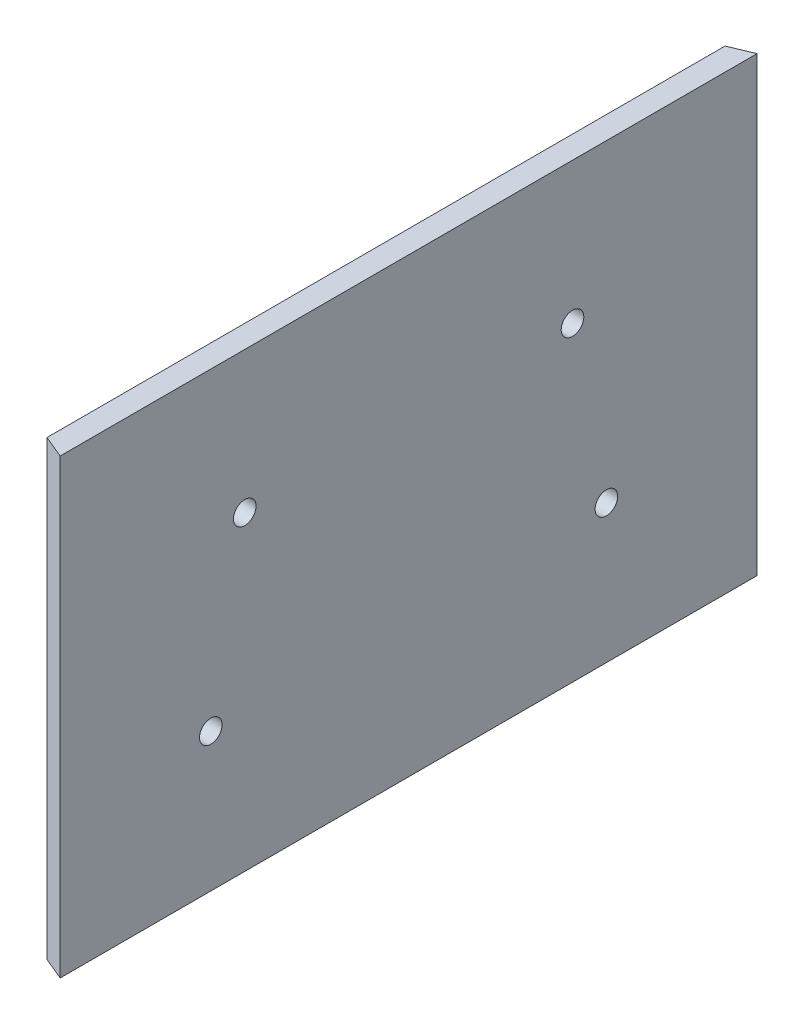
ISO-10303-21;
HEADER;
FILE_DESCRIPTION(('STEP AP214'),'2;1');
FILE_NAME('part.step','',(''),(''),'','','');
FILE_SCHEMA(('AUTOMOTIVE_DESIGN { 1 0 10303 214 1 1 1 1 }'));
ENDSEC;
DATA;
#1=APPLICATION_CONTEXT('core data for automotive mechanical design processes');
#2=APPLICATION_PROTOCOL_DEFINITION('international standard','automotive_design',2000,#1);
#3=PRODUCT_CONTEXT('',#1,'mechanical');
#4=PRODUCT('Part','Part','',(#3));
#5=PRODUCT_RELATED_PRODUCT_CATEGORY('part','',(#4));
#6=PRODUCT_DEFINITION_FORMATION('','',#4);
#7=PRODUCT_DEFINITION_CONTEXT('part definition',#1,'design');
#8=PRODUCT_DEFINITION('design','',#6,#7);
#9=PRODUCT_DEFINITION_SHAPE('','',#8);
#10=(LENGTH_UNIT() NAMED_UNIT(*) SI_UNIT(.MILLI.,.METRE.));
#11=(NAMED_UNIT(*) PLANE_ANGLE_UNIT() SI_UNIT($,.RADIAN.));
#12=(NAMED_UNIT(*) SI_UNIT($,.STERADIAN.) SOLID_ANGLE_UNIT());
#13=UNCERTAINTY_MEASURE_WITH_UNIT(LENGTH_MEASURE(1.E-05),#10,'distance_accuracy_value','');
#14=(GEOMETRIC_REPRESENTATION_CONTEXT(3) GLOBAL_UNCERTAINTY_ASSIGNED_CONTEXT((#13)) GLOBAL_UNIT_ASSIGNED_CONTEXT((#10,
#11,#12)) REPRESENTATION_CONTEXT('',''));
#15=CARTESIAN_POINT('',(0.,0.,0.));
#16=DIRECTION('',(0.,0.,1.));
#17=DIRECTION('',(1.,0.,0.));
#18=AXIS2_PLACEMENT_3D('',#15,#16,#17);
#19=CARTESIAN_POINT('',(0.,50.,-120.));
#20=DIRECTION('',(1.,0.,0.));
#21=DIRECTION('',(0.,0.,-1.));
#22=AXIS2_PLACEMENT_3D('',#19,#20,#21);
#23=PLANE('',#22);
#24=CARTESIAN_POINT('',(0.,25.,-31.));
#25=DIRECTION('',(-1.,0.,0.));
#26=DIRECTION('',(0.,1.,0.));
#27=AXIS2_PLACEMENT_3D('',#24,#25,#26);
#28=CIRCLE('',#27,2.00000000000003);
#29=CARTESIAN_POINT('',(0.,27.,-31.));
#30=VERTEX_POINT('',#29);
#31=EDGE_CURVE('E103',#30,#30,#28,.T.);
#32=ORIENTED_EDGE('',*,*,#31,.T.);
#33=EDGE_LOOP('',(#32));
#34=FACE_BOUND('',#33,.T.);
#35=CARTESIAN_POINT('',(0.,-5.49999999999999,-25.));
#36=DIRECTION('',(-1.,0.,0.));
#37=DIRECTION('',(0.,1.,0.));
#38=AXIS2_PLACEMENT_3D('',#35,#36,#37);
#39=CIRCLE('',#38,2.00000000000003);
#40=CARTESIAN_POINT('',(0.,-3.49999999999996,-25.));
#41=VERTEX_POINT('',#40);
#42=EDGE_CURVE('E109',#41,#41,#39,.T.);
#43=ORIENTED_EDGE('',*,*,#42,.T.);
#44=EDGE_LOOP('',(#43));
#45=FACE_BOUND('',#44,.T.);
#46=CARTESIAN_POINT('',(0.,-5.5,-95.));
#47=DIRECTION('',(-1.,0.,0.));
#48=DIRECTION('',(0.,-1.,0.));
#49=AXIS2_PLACEMENT_3D('',#46,#47,#48);
#50=CIRCLE('',#49,2.);
#51=CARTESIAN_POINT('',(0.,-7.49999999999999,-95.));
#52=VERTEX_POINT('',#51);
#53=EDGE_CURVE('E115',#52,#52,#50,.T.);
#54=ORIENTED_EDGE('',*,*,#53,.T.);
#55=EDGE_LOOP('',(#54));
#56=FACE_BOUND('',#55,.T.);
#57=CARTESIAN_POINT('',(0.,25.,-89.));
#58=DIRECTION('',(-1.,0.,0.));
#59=DIRECTION('',(0.,-1.,0.));
#60=AXIS2_PLACEMENT_3D('',#57,#58,#59);
#61=CIRCLE('',#60,2.);
#62=CARTESIAN_POINT('',(0.,23.,-89.));
#63=VERTEX_POINT('',#62);
#64=EDGE_CURVE('E121',#63,#63,#61,.T.);
#65=ORIENTED_EDGE('',*,*,#64,.T.);
#66=EDGE_LOOP('',(#65));
#67=FACE_BOUND('',#66,.T.);
#68=DIRECTION('',(0.,0.,1.));
#69=VECTOR('',#68,1.);
#70=CARTESIAN_POINT('',(0.,50.,-120.));
#71=LINE('',#70,#69);
#72=CARTESIAN_POINT('',(0.,50.,-121.656854249492));
#73=VERTEX_POINT('',#72);
#74=CARTESIAN_POINT('',(0.,50.,1.65685424949235));
#75=VERTEX_POINT('',#74);
#76=EDGE_CURVE('E37',#73,#75,#71,.T.);
#77=ORIENTED_EDGE('',*,*,#76,.T.);
#78=DIRECTION('',(0.,1.,0.));
#79=VECTOR('',#78,1.);
#80=CARTESIAN_POINT('',(0.,-34.3295688011696,1.65685424949235));
#81=LINE('',#80,#79);
#82=CARTESIAN_POINT('',(0.,-30.,1.65685424949235));
#83=VERTEX_POINT('',#82);
#84=EDGE_CURVE('E98',#83,#75,#81,.T.);
#85=ORIENTED_EDGE('',*,*,#84,.F.);
#86=DIRECTION('',(0.,0.,1.));
#87=VECTOR('',#86,1.);
#88=CARTESIAN_POINT('',(0.,-30.,-120.));
#89=LINE('',#88,#87);
#90=CARTESIAN_POINT('',(0.,-30.,-121.656854249492));
#91=VERTEX_POINT('',#90);
#92=EDGE_CURVE('E11',#91,#83,#89,.T.);
#93=ORIENTED_EDGE('',*,*,#92,.F.);
#94=DIRECTION('',(0.,1.,0.));
#95=VECTOR('',#94,1.);
#96=CARTESIAN_POINT('',(0.,-34.3295688011696,-121.656854249492));
#97=LINE('',#96,#95);
#98=EDGE_CURVE('E84',#91,#73,#97,.T.);
#99=ORIENTED_EDGE('',*,*,#98,.T.);
#100=EDGE_LOOP('',(#77,#85,#93,#99));
#101=FACE_BOUND('',#100,.T.);
#102=ADVANCED_FACE('F34',(#34,#45,#56,#67,#101),#23,.T.);
#103=CARTESIAN_POINT('',(0.,-30.,-120.));
#104=DIRECTION('',(0.,-1.,0.));
#105=DIRECTION('',(0.,0.,-1.));
#106=AXIS2_PLACEMENT_3D('',#103,#104,#105);
#107=PLANE('',#106);
#108=ORIENTED_EDGE('',*,*,#92,.T.);
#109=DIRECTION('',(0.923879532511289,0.,0.382683432365084));
#110=VECTOR('',#109,1.);
#111=CARTESIAN_POINT('',(-4.,-30.,0.));
#112=LINE('',#111,#110);
#113=CARTESIAN_POINT('',(-3.99999999999999,-30.,0.));
#114=VERTEX_POINT('',#113);
#115=EDGE_CURVE('E95',#114,#83,#112,.T.);
#116=ORIENTED_EDGE('',*,*,#115,.F.);
#117=DIRECTION('',(0.,0.,1.));
#118=VECTOR('',#117,1.);
#119=CARTESIAN_POINT('',(-3.99999999999999,-30.,-120.));
#120=LINE('',#119,#118);
#121=CARTESIAN_POINT('',(-4.,-30.,-120.));
#122=VERTEX_POINT('',#121);
#123=EDGE_CURVE('E42',#122,#114,#120,.T.);
#124=ORIENTED_EDGE('',*,*,#123,.F.);
#125=DIRECTION('',(-0.923879532511289,0.,0.382683432365085));
#126=VECTOR('',#125,1.);
#127=CARTESIAN_POINT('',(0.,-30.,-121.656854249492));
#128=LINE('',#127,#126);
#129=EDGE_CURVE('E87',#91,#122,#128,.T.);
#130=ORIENTED_EDGE('',*,*,#129,.F.);
#131=EDGE_LOOP('',(#108,#116,#124,#130));
#132=FACE_BOUND('',#131,.T.);
#133=ADVANCED_FACE('F132',(#132),#107,.T.);
#134=CARTESIAN_POINT('',(-4.,50.,-120.));
#135=DIRECTION('',(-1.,0.,0.));
#136=DIRECTION('',(0.,-1.,0.));
#137=AXIS2_PLACEMENT_3D('',#134,#135,#136);
#138=PLANE('',#137);
#139=CARTESIAN_POINT('',(-4.,25.,-31.));
#140=DIRECTION('',(-1.,0.,0.));
#141=DIRECTION('',(0.,1.,0.));
#142=AXIS2_PLACEMENT_3D('',#139,#140,#141);
#143=CIRCLE('',#142,2.00000000000003);
#144=CARTESIAN_POINT('',(-4.,27.,-31.));
#145=VERTEX_POINT('',#144);
#146=EDGE_CURVE('E100',#145,#145,#143,.T.);
#147=ORIENTED_EDGE('',*,*,#146,.F.);
#148=EDGE_LOOP('',(#147));
#149=FACE_BOUND('',#148,.T.);
#150=CARTESIAN_POINT('',(-3.99999999999999,-5.49999999999999,-25.));
#151=DIRECTION('',(-1.,0.,0.));
#152=DIRECTION('',(0.,1.,0.));
#153=AXIS2_PLACEMENT_3D('',#150,#151,#152);
#154=CIRCLE('',#153,2.00000000000003);
#155=CARTESIAN_POINT('',(-3.99999999999999,-3.49999999999996,-25.));
#156=VERTEX_POINT('',#155);
#157=EDGE_CURVE('E106',#156,#156,#154,.T.);
#158=ORIENTED_EDGE('',*,*,#157,.F.);
#159=EDGE_LOOP('',(#158));
#160=FACE_BOUND('',#159,.T.);
#161=CARTESIAN_POINT('',(-3.99999999999999,-5.5,-95.));
#162=DIRECTION('',(-1.,0.,0.));
#163=DIRECTION('',(0.,-1.,0.));
#164=AXIS2_PLACEMENT_3D('',#161,#162,#163);
#165=CIRCLE('',#164,2.);
#166=CARTESIAN_POINT('',(-3.99999999999999,-7.49999999999999,-95.));
#167=VERTEX_POINT('',#166);
#168=EDGE_CURVE('E112',#167,#167,#165,.T.);
#169=ORIENTED_EDGE('',*,*,#168,.F.);
#170=EDGE_LOOP('',(#169));
#171=FACE_BOUND('',#170,.T.);
#172=CARTESIAN_POINT('',(-4.,25.,-89.));
#173=DIRECTION('',(-1.,0.,0.));
#174=DIRECTION('',(0.,-1.,0.));
#175=AXIS2_PLACEMENT_3D('',#172,#173,#174);
#176=CIRCLE('',#175,2.);
#177=CARTESIAN_POINT('',(-4.,23.,-89.));
#178=VERTEX_POINT('',#177);
#179=EDGE_CURVE('E118',#178,#178,#176,.T.);
#180=ORIENTED_EDGE('',*,*,#179,.F.);
#181=EDGE_LOOP('',(#180));
#182=FACE_BOUND('',#181,.T.);
#183=DIRECTION('',(0.,-1.,0.));
#184=VECTOR('',#183,1.);
#185=CARTESIAN_POINT('',(-4.,50.,0.));
#186=LINE('',#185,#184);
#187=CARTESIAN_POINT('',(-4.,50.,0.));
#188=VERTEX_POINT('',#187);
#189=EDGE_CURVE('E124',#188,#114,#186,.T.);
#190=ORIENTED_EDGE('',*,*,#189,.F.);
#191=DIRECTION('',(0.,0.,1.));
#192=VECTOR('',#191,1.);
#193=CARTESIAN_POINT('',(-4.,50.,-120.));
#194=LINE('',#193,#192);
#195=CARTESIAN_POINT('',(-4.,50.,-120.));
#196=VERTEX_POINT('',#195);
#197=EDGE_CURVE('E81',#196,#188,#194,.T.);
#198=ORIENTED_EDGE('',*,*,#197,.F.);
#199=DIRECTION('',(0.,-1.,0.));
#200=VECTOR('',#199,1.);
#201=CARTESIAN_POINT('',(-4.,50.,-120.));
#202=LINE('',#201,#200);
#203=EDGE_CURVE('E82',#196,#122,#202,.T.);
#204=ORIENTED_EDGE('',*,*,#203,.T.);
#205=ORIENTED_EDGE('',*,*,#123,.T.);
#206=EDGE_LOOP('',(#190,#198,#204,#205));
#207=FACE_BOUND('',#206,.T.);
#208=ADVANCED_FACE('F128',(#149,#160,#171,#182,#207),#138,.T.);
#209=CARTESIAN_POINT('',(0.,50.,-120.));
#210=DIRECTION('',(0.,1.,0.));
#211=DIRECTION('',(0.,0.,1.));
#212=AXIS2_PLACEMENT_3D('',#209,#210,#211);
#213=PLANE('',#212);
#214=ORIENTED_EDGE('',*,*,#197,.T.);
#215=DIRECTION('',(0.923879532511289,0.,0.382683432365084));
#216=VECTOR('',#215,1.);
#217=CARTESIAN_POINT('',(-4.,50.,0.));
#218=LINE('',#217,#216);
#219=EDGE_CURVE('E77',#188,#75,#218,.T.);
#220=ORIENTED_EDGE('',*,*,#219,.T.);
#221=ORIENTED_EDGE('',*,*,#76,.F.);
#222=DIRECTION('',(-0.923879532511289,0.,0.382683432365085));
#223=VECTOR('',#222,1.);
#224=CARTESIAN_POINT('',(0.,50.,-121.656854249492));
#225=LINE('',#224,#223);
#226=EDGE_CURVE('E50',#73,#196,#225,.T.);
#227=ORIENTED_EDGE('',*,*,#226,.T.);
#228=EDGE_LOOP('',(#214,#220,#221,#227));
#229=FACE_BOUND('',#228,.T.);
#230=ADVANCED_FACE('F75',(#229),#213,.T.);
#231=CARTESIAN_POINT('',(0.,25.,-89.));
#232=DIRECTION('',(-1.,0.,0.));
#233=DIRECTION('',(0.,-1.,0.));
#234=AXIS2_PLACEMENT_3D('',#231,#232,#233);
#235=CYLINDRICAL_SURFACE('',#234,2.);
#236=ORIENTED_EDGE('',*,*,#64,.F.);
#237=EDGE_LOOP('',(#236));
#238=FACE_BOUND('',#237,.T.);
#239=ORIENTED_EDGE('',*,*,#179,.T.);
#240=EDGE_LOOP('',(#239));
#241=FACE_BOUND('',#240,.T.);
#242=ADVANCED_FACE('F143',(#238,#241),#235,.F.);
#243=CARTESIAN_POINT('',(0.,-5.5,-95.));
#244=DIRECTION('',(-1.,0.,0.));
#245=DIRECTION('',(0.,-1.,0.));
#246=AXIS2_PLACEMENT_3D('',#243,#244,#245);
#247=CYLINDRICAL_SURFACE('',#246,2.);
#248=ORIENTED_EDGE('',*,*,#53,.F.);
#249=EDGE_LOOP('',(#248));
#250=FACE_BOUND('',#249,.T.);
#251=ORIENTED_EDGE('',*,*,#168,.T.);
#252=EDGE_LOOP('',(#251));
#253=FACE_BOUND('',#252,.T.);
#254=ADVANCED_FACE('F149',(#250,#253),#247,.F.);
#255=CARTESIAN_POINT('',(0.,-5.49999999999999,-25.));
#256=DIRECTION('',(-1.,0.,0.));
#257=DIRECTION('',(0.,-1.,0.));
#258=AXIS2_PLACEMENT_3D('',#255,#256,#257);
#259=CYLINDRICAL_SURFACE('',#258,2.00000000000003);
#260=ORIENTED_EDGE('',*,*,#42,.F.);
#261=EDGE_LOOP('',(#260));
#262=FACE_BOUND('',#261,.T.);
#263=ORIENTED_EDGE('',*,*,#157,.T.);
#264=EDGE_LOOP('',(#263));
#265=FACE_BOUND('',#264,.T.);
#266=ADVANCED_FACE('F154',(#262,#265),#259,.F.);
#267=CARTESIAN_POINT('',(0.,25.,-31.));
#268=DIRECTION('',(-1.,0.,0.));
#269=DIRECTION('',(0.,-1.,0.));
#270=AXIS2_PLACEMENT_3D('',#267,#268,#269);
#271=CYLINDRICAL_SURFACE('',#270,2.00000000000003);
#272=ORIENTED_EDGE('',*,*,#31,.F.);
#273=EDGE_LOOP('',(#272));
#274=FACE_BOUND('',#273,.T.);
#275=ORIENTED_EDGE('',*,*,#146,.T.);
#276=EDGE_LOOP('',(#275));
#277=FACE_BOUND('',#276,.T.);
#278=ADVANCED_FACE('F164',(#274,#277),#271,.F.);
#279=CARTESIAN_POINT('',(-4.,-34.3295688011696,0.));
#280=DIRECTION('',(-0.382683432365084,0.,0.923879532511289));
#281=DIRECTION('',(0.923879532511289,0.,0.382683432365084));
#282=AXIS2_PLACEMENT_3D('',#279,#280,#281);
#283=PLANE('',#282);
#284=ORIENTED_EDGE('',*,*,#189,.T.);
#285=ORIENTED_EDGE('',*,*,#115,.T.);
#286=ORIENTED_EDGE('',*,*,#84,.T.);
#287=ORIENTED_EDGE('',*,*,#219,.F.);
#288=EDGE_LOOP('',(#284,#285,#286,#287));
#289=FACE_BOUND('',#288,.T.);
#290=ADVANCED_FACE('F130',(#289),#283,.T.);
#291=CARTESIAN_POINT('',(0.,-34.3295688011696,-121.656854249492));
#292=DIRECTION('',(-0.382683432365085,0.,-0.923879532511289));
#293=DIRECTION('',(-0.923879532511289,0.,0.382683432365085));
#294=AXIS2_PLACEMENT_3D('',#291,#292,#293);
#295=PLANE('',#294);
#296=ORIENTED_EDGE('',*,*,#98,.F.);
#297=ORIENTED_EDGE('',*,*,#129,.T.);
#298=ORIENTED_EDGE('',*,*,#203,.F.);
#299=ORIENTED_EDGE('',*,*,#226,.F.);
#300=EDGE_LOOP('',(#296,#297,#298,#299));
#301=FACE_BOUND('',#300,.T.);
#302=ADVANCED_FACE('F89',(#301),#295,.T.);
#303=CLOSED_SHELL('',(#102,#133,#208,#230,#242,#254,#266,#278,#290,#302));
#304=MANIFOLD_SOLID_BREP('B2',#303);
#305=ADVANCED_BREP_SHAPE_REPRESENTATION('',(#18,#304),#14);
#306=SHAPE_DEFINITION_REPRESENTATION(#9,#305);
ENDSEC;
END-ISO-10303-21;
